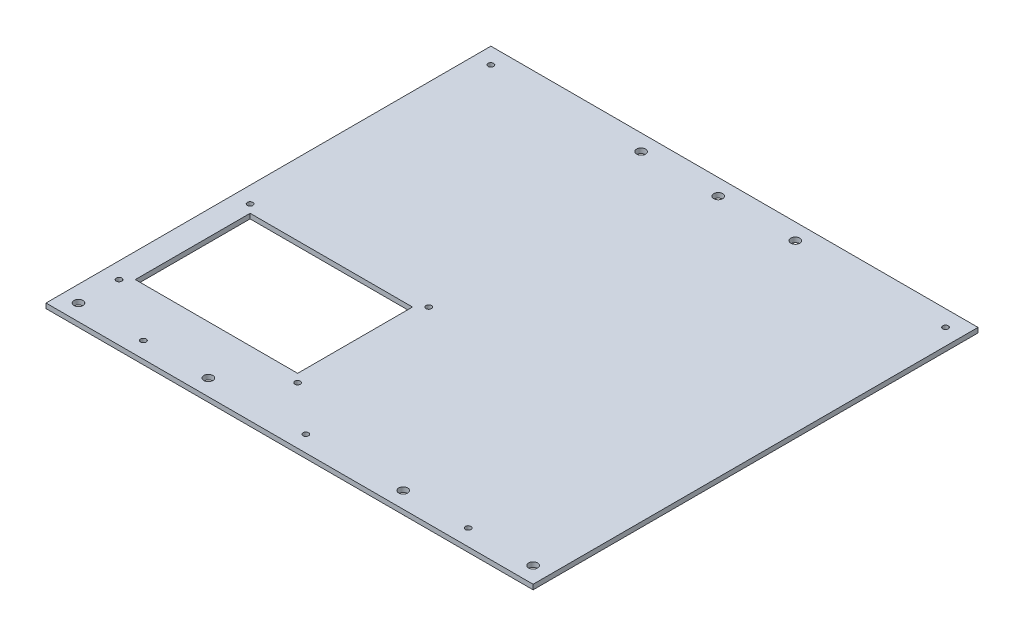
ISO-10303-21;
HEADER;
FILE_DESCRIPTION(('STEP AP214'),'2;1');
FILE_NAME('part.step','',(''),(''),'','','');
FILE_SCHEMA(('AUTOMOTIVE_DESIGN { 1 0 10303 214 1 1 1 1 }'));
ENDSEC;
DATA;
#1=APPLICATION_CONTEXT('core data for automotive mechanical design processes');
#2=APPLICATION_PROTOCOL_DEFINITION('international standard','automotive_design',2000,#1);
#3=PRODUCT_CONTEXT('',#1,'mechanical');
#4=PRODUCT('Part','Part','',(#3));
#5=PRODUCT_RELATED_PRODUCT_CATEGORY('part','',(#4));
#6=PRODUCT_DEFINITION_FORMATION('','',#4);
#7=PRODUCT_DEFINITION_CONTEXT('part definition',#1,'design');
#8=PRODUCT_DEFINITION('design','',#6,#7);
#9=PRODUCT_DEFINITION_SHAPE('','',#8);
#10=(LENGTH_UNIT() NAMED_UNIT(*) SI_UNIT(.MILLI.,.METRE.));
#11=(NAMED_UNIT(*) PLANE_ANGLE_UNIT() SI_UNIT($,.RADIAN.));
#12=(NAMED_UNIT(*) SI_UNIT($,.STERADIAN.) SOLID_ANGLE_UNIT());
#13=UNCERTAINTY_MEASURE_WITH_UNIT(LENGTH_MEASURE(1.E-05),#10,'distance_accuracy_value','');
#14=(GEOMETRIC_REPRESENTATION_CONTEXT(3) GLOBAL_UNCERTAINTY_ASSIGNED_CONTEXT((#13)) GLOBAL_UNIT_ASSIGNED_CONTEXT((#10,
#11,#12)) REPRESENTATION_CONTEXT('',''));
#15=CARTESIAN_POINT('',(0.,0.,0.));
#16=DIRECTION('',(0.,0.,1.));
#17=DIRECTION('',(1.,0.,0.));
#18=AXIS2_PLACEMENT_3D('',#15,#16,#17);
#19=CARTESIAN_POINT('',(0.,3.,0.));
#20=DIRECTION('',(0.,1.,0.));
#21=DIRECTION('',(0.,0.,1.));
#22=AXIS2_PLACEMENT_3D('',#19,#20,#21);
#23=PLANE('',#22);
#24=CARTESIAN_POINT('',(9.99999999999996,3.,-115.707070707071));
#25=DIRECTION('',(0.,1.,0.));
#26=DIRECTION('',(0.,0.,1.));
#27=AXIS2_PLACEMENT_3D('',#24,#25,#26);
#28=CIRCLE('',#27,1.69999999999999);
#29=CARTESIAN_POINT('',(9.99999999999996,3.,-114.007070707071));
#30=VERTEX_POINT('',#29);
#31=EDGE_CURVE('E475',#30,#30,#28,.T.);
#32=ORIENTED_EDGE('',*,*,#31,.F.);
#33=EDGE_LOOP('',(#32));
#34=FACE_BOUND('',#33,.T.);
#35=CARTESIAN_POINT('',(120.,3.,-35.));
#36=DIRECTION('',(0.,1.,0.));
#37=DIRECTION('',(0.,0.,1.));
#38=AXIS2_PLACEMENT_3D('',#35,#36,#37);
#39=CIRCLE('',#38,1.69999999999999);
#40=CARTESIAN_POINT('',(120.,3.,-33.3));
#41=VERTEX_POINT('',#40);
#42=EDGE_CURVE('E477',#41,#41,#39,.T.);
#43=ORIENTED_EDGE('',*,*,#42,.F.);
#44=EDGE_LOOP('',(#43));
#45=FACE_BOUND('',#44,.T.);
#46=CARTESIAN_POINT('',(9.99999999999997,3.,-35.));
#47=DIRECTION('',(0.,1.,0.));
#48=DIRECTION('',(0.,0.,1.));
#49=AXIS2_PLACEMENT_3D('',#46,#47,#48);
#50=CIRCLE('',#49,1.69999999999999);
#51=CARTESIAN_POINT('',(9.99999999999997,3.,-33.3));
#52=VERTEX_POINT('',#51);
#53=EDGE_CURVE('E485',#52,#52,#50,.T.);
#54=ORIENTED_EDGE('',*,*,#53,.F.);
#55=EDGE_LOOP('',(#54));
#56=FACE_BOUND('',#55,.T.);
#57=CARTESIAN_POINT('',(120.,3.,-115.707070707071));
#58=DIRECTION('',(0.,1.,0.));
#59=DIRECTION('',(0.,0.,1.));
#60=AXIS2_PLACEMENT_3D('',#57,#58,#59);
#61=CIRCLE('',#60,1.69999999999999);
#62=CARTESIAN_POINT('',(120.,3.,-114.007070707071));
#63=VERTEX_POINT('',#62);
#64=EDGE_CURVE('E491',#63,#63,#61,.T.);
#65=ORIENTED_EDGE('',*,*,#64,.F.);
#66=EDGE_LOOP('',(#65));
#67=FACE_BOUND('',#66,.T.);
#68=DIRECTION('',(0.,0.,1.));
#69=VECTOR('',#68,1.);
#70=CARTESIAN_POINT('',(15.,3.,-110.707070707071));
#71=LINE('',#70,#69);
#72=CARTESIAN_POINT('',(15.,3.,-110.707070707071));
#73=VERTEX_POINT('',#72);
#74=CARTESIAN_POINT('',(15.,3.,-40.));
#75=VERTEX_POINT('',#74);
#76=EDGE_CURVE('E55',#73,#75,#71,.T.);
#77=ORIENTED_EDGE('',*,*,#76,.F.);
#78=DIRECTION('',(-1.,0.,0.));
#79=VECTOR('',#78,1.);
#80=CARTESIAN_POINT('',(15.,3.,-110.707070707071));
#81=LINE('',#80,#79);
#82=CARTESIAN_POINT('',(115.,3.,-110.707070707071));
#83=VERTEX_POINT('',#82);
#84=EDGE_CURVE('E123',#83,#73,#81,.T.);
#85=ORIENTED_EDGE('',*,*,#84,.F.);
#86=DIRECTION('',(0.,0.,-1.));
#87=VECTOR('',#86,1.);
#88=CARTESIAN_POINT('',(115.,3.,-110.707070707071));
#89=LINE('',#88,#87);
#90=CARTESIAN_POINT('',(115.,3.,-40.));
#91=VERTEX_POINT('',#90);
#92=EDGE_CURVE('E108',#91,#83,#89,.T.);
#93=ORIENTED_EDGE('',*,*,#92,.F.);
#94=DIRECTION('',(1.,0.,0.));
#95=VECTOR('',#94,1.);
#96=CARTESIAN_POINT('',(15.,3.,-40.));
#97=LINE('',#96,#95);
#98=EDGE_CURVE('E117',#75,#91,#97,.T.);
#99=ORIENTED_EDGE('',*,*,#98,.F.);
#100=EDGE_LOOP('',(#77,#85,#93,#99));
#101=FACE_BOUND('',#100,.T.);
#102=CARTESIAN_POINT('',(250.,3.,-10.));
#103=DIRECTION('',(0.,1.,0.));
#104=DIRECTION('',(0.,0.,1.));
#105=AXIS2_PLACEMENT_3D('',#102,#103,#104);
#106=CIRCLE('',#105,1.69999999999998);
#107=CARTESIAN_POINT('',(250.,3.,-8.30000000000002));
#108=VERTEX_POINT('',#107);
#109=EDGE_CURVE('E130',#108,#108,#106,.T.);
#110=ORIENTED_EDGE('',*,*,#109,.F.);
#111=EDGE_LOOP('',(#110));
#112=FACE_BOUND('',#111,.T.);
#113=CARTESIAN_POINT('',(150.,3.,-10.));
#114=DIRECTION('',(0.,1.,0.));
#115=DIRECTION('',(0.,0.,1.));
#116=AXIS2_PLACEMENT_3D('',#113,#114,#115);
#117=CIRCLE('',#116,1.70000000000001);
#118=CARTESIAN_POINT('',(150.,3.,-8.3));
#119=VERTEX_POINT('',#118);
#120=EDGE_CURVE('E138',#119,#119,#117,.T.);
#121=ORIENTED_EDGE('',*,*,#120,.F.);
#122=EDGE_LOOP('',(#121));
#123=FACE_BOUND('',#122,.T.);
#124=CARTESIAN_POINT('',(50.,3.,-10.));
#125=DIRECTION('',(0.,1.,0.));
#126=DIRECTION('',(0.,0.,1.));
#127=AXIS2_PLACEMENT_3D('',#124,#125,#126);
#128=CIRCLE('',#127,1.7);
#129=CARTESIAN_POINT('',(50.,3.,-8.3));
#130=VERTEX_POINT('',#129);
#131=EDGE_CURVE('E144',#130,#130,#128,.T.);
#132=ORIENTED_EDGE('',*,*,#131,.F.);
#133=EDGE_LOOP('',(#132));
#134=FACE_BOUND('',#133,.T.);
#135=CARTESIAN_POINT('',(10.,3.,-264.));
#136=DIRECTION('',(0.,1.,0.));
#137=DIRECTION('',(0.,0.,1.));
#138=AXIS2_PLACEMENT_3D('',#135,#136,#137);
#139=CIRCLE('',#138,1.7);
#140=CARTESIAN_POINT('',(10.,3.,-262.3));
#141=VERTEX_POINT('',#140);
#142=EDGE_CURVE('E150',#141,#141,#139,.T.);
#143=ORIENTED_EDGE('',*,*,#142,.F.);
#144=EDGE_LOOP('',(#143));
#145=FACE_BOUND('',#144,.T.);
#146=CARTESIAN_POINT('',(290.,3.,-264.));
#147=DIRECTION('',(0.,1.,0.));
#148=DIRECTION('',(0.,0.,1.));
#149=AXIS2_PLACEMENT_3D('',#146,#147,#148);
#150=CIRCLE('',#149,1.69999999999998);
#151=CARTESIAN_POINT('',(290.,3.,-262.3));
#152=VERTEX_POINT('',#151);
#153=EDGE_CURVE('E156',#152,#152,#150,.T.);
#154=ORIENTED_EDGE('',*,*,#153,.F.);
#155=EDGE_LOOP('',(#154));
#156=FACE_BOUND('',#155,.T.);
#157=CARTESIAN_POINT('',(10.,3.,-10.));
#158=DIRECTION('',(0.,-1.,0.));
#159=DIRECTION('',(0.,0.,-1.));
#160=AXIS2_PLACEMENT_3D('',#157,#158,#159);
#161=CIRCLE('',#160,2.75);
#162=CARTESIAN_POINT('',(10.,3.,-12.75));
#163=VERTEX_POINT('',#162);
#164=EDGE_CURVE('E165',#163,#163,#161,.T.);
#165=ORIENTED_EDGE('',*,*,#164,.T.);
#166=EDGE_LOOP('',(#165));
#167=FACE_BOUND('',#166,.T.);
#168=DIRECTION('',(1.,0.,0.));
#169=VECTOR('',#168,1.);
#170=CARTESIAN_POINT('',(0.,3.,0.));
#171=LINE('',#170,#169);
#172=CARTESIAN_POINT('',(0.,3.,0.));
#173=VERTEX_POINT('',#172);
#174=CARTESIAN_POINT('',(300.,3.,0.));
#175=VERTEX_POINT('',#174);
#176=EDGE_CURVE('E205',#173,#175,#171,.T.);
#177=ORIENTED_EDGE('',*,*,#176,.T.);
#178=DIRECTION('',(0.,0.,-1.));
#179=VECTOR('',#178,1.);
#180=CARTESIAN_POINT('',(300.,3.,0.));
#181=LINE('',#180,#179);
#182=CARTESIAN_POINT('',(300.,3.,-274.));
#183=VERTEX_POINT('',#182);
#184=EDGE_CURVE('E208',#175,#183,#181,.T.);
#185=ORIENTED_EDGE('',*,*,#184,.T.);
#186=DIRECTION('',(1.,0.,0.));
#187=VECTOR('',#186,1.);
#188=CARTESIAN_POINT('',(0.,3.,-274.));
#189=LINE('',#188,#187);
#190=CARTESIAN_POINT('',(-1.11022302462516E-13,3.,-274.));
#191=VERTEX_POINT('',#190);
#192=EDGE_CURVE('E211',#191,#183,#189,.T.);
#193=ORIENTED_EDGE('',*,*,#192,.F.);
#194=DIRECTION('',(0.,0.,-1.));
#195=VECTOR('',#194,1.);
#196=CARTESIAN_POINT('',(0.,3.,0.));
#197=LINE('',#196,#195);
#198=EDGE_CURVE('E214',#173,#191,#197,.T.);
#199=ORIENTED_EDGE('',*,*,#198,.F.);
#200=EDGE_LOOP('',(#177,#185,#193,#199));
#201=FACE_BOUND('',#200,.T.);
#202=CARTESIAN_POINT('',(150.,3.,-264.));
#203=DIRECTION('',(0.,-1.,0.));
#204=DIRECTION('',(0.,0.,-1.));
#205=AXIS2_PLACEMENT_3D('',#202,#203,#204);
#206=CIRCLE('',#205,2.75);
#207=CARTESIAN_POINT('',(150.,3.,-266.75));
#208=VERTEX_POINT('',#207);
#209=EDGE_CURVE('E201',#208,#208,#206,.T.);
#210=ORIENTED_EDGE('',*,*,#209,.T.);
#211=EDGE_LOOP('',(#210));
#212=FACE_BOUND('',#211,.T.);
#213=CARTESIAN_POINT('',(102.5,3.,-264.));
#214=DIRECTION('',(0.,-1.,0.));
#215=DIRECTION('',(0.,0.,-1.));
#216=AXIS2_PLACEMENT_3D('',#213,#214,#215);
#217=CIRCLE('',#216,2.75);
#218=CARTESIAN_POINT('',(102.5,3.,-266.75));
#219=VERTEX_POINT('',#218);
#220=EDGE_CURVE('E195',#219,#219,#217,.T.);
#221=ORIENTED_EDGE('',*,*,#220,.T.);
#222=EDGE_LOOP('',(#221));
#223=FACE_BOUND('',#222,.T.);
#224=CARTESIAN_POINT('',(197.5,3.,-264.));
#225=DIRECTION('',(0.,-1.,0.));
#226=DIRECTION('',(0.,0.,-1.));
#227=AXIS2_PLACEMENT_3D('',#224,#225,#226);
#228=CIRCLE('',#227,2.75);
#229=CARTESIAN_POINT('',(197.5,3.,-266.75));
#230=VERTEX_POINT('',#229);
#231=EDGE_CURVE('E189',#230,#230,#228,.T.);
#232=ORIENTED_EDGE('',*,*,#231,.T.);
#233=EDGE_LOOP('',(#232));
#234=FACE_BOUND('',#233,.T.);
#235=CARTESIAN_POINT('',(290.,3.,-10.));
#236=DIRECTION('',(0.,-1.,0.));
#237=DIRECTION('',(0.,0.,-1.));
#238=AXIS2_PLACEMENT_3D('',#235,#236,#237);
#239=CIRCLE('',#238,2.74999999999997);
#240=CARTESIAN_POINT('',(290.,3.,-12.75));
#241=VERTEX_POINT('',#240);
#242=EDGE_CURVE('E183',#241,#241,#239,.T.);
#243=ORIENTED_EDGE('',*,*,#242,.T.);
#244=EDGE_LOOP('',(#243));
#245=FACE_BOUND('',#244,.T.);
#246=CARTESIAN_POINT('',(210.,3.,-10.));
#247=DIRECTION('',(0.,-1.,0.));
#248=DIRECTION('',(0.,0.,-1.));
#249=AXIS2_PLACEMENT_3D('',#246,#247,#248);
#250=CIRCLE('',#249,2.75);
#251=CARTESIAN_POINT('',(210.,3.,-12.75));
#252=VERTEX_POINT('',#251);
#253=EDGE_CURVE('E177',#252,#252,#250,.T.);
#254=ORIENTED_EDGE('',*,*,#253,.T.);
#255=EDGE_LOOP('',(#254));
#256=FACE_BOUND('',#255,.T.);
#257=CARTESIAN_POINT('',(90.,3.,-10.));
#258=DIRECTION('',(0.,-1.,0.));
#259=DIRECTION('',(0.,0.,-1.));
#260=AXIS2_PLACEMENT_3D('',#257,#258,#259);
#261=CIRCLE('',#260,2.75);
#262=CARTESIAN_POINT('',(90.,3.,-12.75));
#263=VERTEX_POINT('',#262);
#264=EDGE_CURVE('E171',#263,#263,#261,.T.);
#265=ORIENTED_EDGE('',*,*,#264,.T.);
#266=EDGE_LOOP('',(#265));
#267=FACE_BOUND('',#266,.T.);
#268=ADVANCED_FACE('F40',(#34,#45,#56,#67,#101,#112,#123,#134,#145,#156,#167,#201,#212,#223,
#234,#245,#256,#267),#23,.T.);
#269=CARTESIAN_POINT('',(0.,3.,0.));
#270=DIRECTION('',(0.,0.,-1.));
#271=DIRECTION('',(-1.,0.,0.));
#272=AXIS2_PLACEMENT_3D('',#269,#270,#271);
#273=PLANE('',#272);
#274=DIRECTION('',(1.,0.,0.));
#275=VECTOR('',#274,1.);
#276=CARTESIAN_POINT('',(0.,0.,0.));
#277=LINE('',#276,#275);
#278=CARTESIAN_POINT('',(0.,0.,0.));
#279=VERTEX_POINT('',#278);
#280=CARTESIAN_POINT('',(300.,0.,0.));
#281=VERTEX_POINT('',#280);
#282=EDGE_CURVE('E204',#279,#281,#277,.T.);
#283=ORIENTED_EDGE('',*,*,#282,.T.);
#284=DIRECTION('',(0.,-1.,0.));
#285=VECTOR('',#284,1.);
#286=CARTESIAN_POINT('',(300.,3.,0.));
#287=LINE('',#286,#285);
#288=EDGE_CURVE('E233',#175,#281,#287,.T.);
#289=ORIENTED_EDGE('',*,*,#288,.F.);
#290=ORIENTED_EDGE('',*,*,#176,.F.);
#291=DIRECTION('',(0.,-1.,0.));
#292=VECTOR('',#291,1.);
#293=CARTESIAN_POINT('',(0.,3.,0.));
#294=LINE('',#293,#292);
#295=EDGE_CURVE('E217',#173,#279,#294,.T.);
#296=ORIENTED_EDGE('',*,*,#295,.T.);
#297=EDGE_LOOP('',(#283,#289,#290,#296));
#298=FACE_BOUND('',#297,.T.);
#299=ADVANCED_FACE('F42',(#298),#273,.F.);
#300=CARTESIAN_POINT('',(300.,3.,0.));
#301=DIRECTION('',(-1.,0.,0.));
#302=DIRECTION('',(0.,0.,1.));
#303=AXIS2_PLACEMENT_3D('',#300,#301,#302);
#304=PLANE('',#303);
#305=DIRECTION('',(0.,0.,-1.));
#306=VECTOR('',#305,1.);
#307=CARTESIAN_POINT('',(300.,0.,0.));
#308=LINE('',#307,#306);
#309=CARTESIAN_POINT('',(300.,0.,-274.));
#310=VERTEX_POINT('',#309);
#311=EDGE_CURVE('E220',#281,#310,#308,.T.);
#312=ORIENTED_EDGE('',*,*,#311,.T.);
#313=DIRECTION('',(0.,-1.,0.));
#314=VECTOR('',#313,1.);
#315=CARTESIAN_POINT('',(300.,3.,-274.));
#316=LINE('',#315,#314);
#317=EDGE_CURVE('E231',#183,#310,#316,.T.);
#318=ORIENTED_EDGE('',*,*,#317,.F.);
#319=ORIENTED_EDGE('',*,*,#184,.F.);
#320=ORIENTED_EDGE('',*,*,#288,.T.);
#321=EDGE_LOOP('',(#312,#318,#319,#320));
#322=FACE_BOUND('',#321,.T.);
#323=ADVANCED_FACE('F266',(#322),#304,.F.);
#324=CARTESIAN_POINT('',(0.,3.,-274.));
#325=DIRECTION('',(0.,0.,-1.));
#326=DIRECTION('',(-1.,0.,0.));
#327=AXIS2_PLACEMENT_3D('',#324,#325,#326);
#328=PLANE('',#327);
#329=DIRECTION('',(1.,0.,0.));
#330=VECTOR('',#329,1.);
#331=CARTESIAN_POINT('',(0.,0.,-274.));
#332=LINE('',#331,#330);
#333=CARTESIAN_POINT('',(-1.11022302462516E-13,0.,-274.));
#334=VERTEX_POINT('',#333);
#335=EDGE_CURVE('E223',#334,#310,#332,.T.);
#336=ORIENTED_EDGE('',*,*,#335,.F.);
#337=DIRECTION('',(0.,-1.,0.));
#338=VECTOR('',#337,1.);
#339=CARTESIAN_POINT('',(-1.11022302462516E-13,3.,-274.));
#340=LINE('',#339,#338);
#341=EDGE_CURVE('E229',#191,#334,#340,.T.);
#342=ORIENTED_EDGE('',*,*,#341,.F.);
#343=ORIENTED_EDGE('',*,*,#192,.T.);
#344=ORIENTED_EDGE('',*,*,#317,.T.);
#345=EDGE_LOOP('',(#336,#342,#343,#344));
#346=FACE_BOUND('',#345,.T.);
#347=ADVANCED_FACE('F279',(#346),#328,.T.);
#348=CARTESIAN_POINT('',(0.,3.,0.));
#349=DIRECTION('',(-1.,0.,0.));
#350=DIRECTION('',(0.,0.,1.));
#351=AXIS2_PLACEMENT_3D('',#348,#349,#350);
#352=PLANE('',#351);
#353=DIRECTION('',(0.,0.,-1.));
#354=VECTOR('',#353,1.);
#355=CARTESIAN_POINT('',(0.,0.,0.));
#356=LINE('',#355,#354);
#357=EDGE_CURVE('E209',#279,#334,#356,.T.);
#358=ORIENTED_EDGE('',*,*,#357,.F.);
#359=ORIENTED_EDGE('',*,*,#295,.F.);
#360=ORIENTED_EDGE('',*,*,#198,.T.);
#361=ORIENTED_EDGE('',*,*,#341,.T.);
#362=EDGE_LOOP('',(#358,#359,#360,#361));
#363=FACE_BOUND('',#362,.T.);
#364=ADVANCED_FACE('F275',(#363),#352,.T.);
#365=CARTESIAN_POINT('',(0.,0.,0.));
#366=DIRECTION('',(0.,1.,0.));
#367=DIRECTION('',(0.,0.,1.));
#368=AXIS2_PLACEMENT_3D('',#365,#366,#367);
#369=PLANE('',#368);
#370=CARTESIAN_POINT('',(9.99999999999996,0.,-115.707070707071));
#371=DIRECTION('',(0.,1.,0.));
#372=DIRECTION('',(0.,0.,1.));
#373=AXIS2_PLACEMENT_3D('',#370,#371,#372);
#374=CIRCLE('',#373,1.7);
#375=CARTESIAN_POINT('',(9.99999999999996,0.,-114.007070707071));
#376=VERTEX_POINT('',#375);
#377=EDGE_CURVE('E473',#376,#376,#374,.T.);
#378=ORIENTED_EDGE('',*,*,#377,.T.);
#379=EDGE_LOOP('',(#378));
#380=FACE_BOUND('',#379,.T.);
#381=CARTESIAN_POINT('',(120.,0.,-35.));
#382=DIRECTION('',(0.,1.,0.));
#383=DIRECTION('',(0.,0.,1.));
#384=AXIS2_PLACEMENT_3D('',#381,#382,#383);
#385=CIRCLE('',#384,1.69999999999999);
#386=CARTESIAN_POINT('',(120.,0.,-33.3));
#387=VERTEX_POINT('',#386);
#388=EDGE_CURVE('E482',#387,#387,#385,.T.);
#389=ORIENTED_EDGE('',*,*,#388,.T.);
#390=EDGE_LOOP('',(#389));
#391=FACE_BOUND('',#390,.T.);
#392=CARTESIAN_POINT('',(9.99999999999997,0.,-35.));
#393=DIRECTION('',(0.,1.,0.));
#394=DIRECTION('',(0.,0.,1.));
#395=AXIS2_PLACEMENT_3D('',#392,#393,#394);
#396=CIRCLE('',#395,1.7);
#397=CARTESIAN_POINT('',(9.99999999999997,0.,-33.3));
#398=VERTEX_POINT('',#397);
#399=EDGE_CURVE('E488',#398,#398,#396,.T.);
#400=ORIENTED_EDGE('',*,*,#399,.T.);
#401=EDGE_LOOP('',(#400));
#402=FACE_BOUND('',#401,.T.);
#403=CARTESIAN_POINT('',(120.,0.,-115.707070707071));
#404=DIRECTION('',(0.,1.,0.));
#405=DIRECTION('',(0.,0.,1.));
#406=AXIS2_PLACEMENT_3D('',#403,#404,#405);
#407=CIRCLE('',#406,1.69999999999999);
#408=CARTESIAN_POINT('',(120.,0.,-114.007070707071));
#409=VERTEX_POINT('',#408);
#410=EDGE_CURVE('E494',#409,#409,#407,.T.);
#411=ORIENTED_EDGE('',*,*,#410,.T.);
#412=EDGE_LOOP('',(#411));
#413=FACE_BOUND('',#412,.T.);
#414=DIRECTION('',(-1.,0.,0.));
#415=VECTOR('',#414,1.);
#416=CARTESIAN_POINT('',(0.,0.,-110.707070707071));
#417=LINE('',#416,#415);
#418=CARTESIAN_POINT('',(115.,0.,-110.707070707071));
#419=VERTEX_POINT('',#418);
#420=CARTESIAN_POINT('',(15.,0.,-110.707070707071));
#421=VERTEX_POINT('',#420);
#422=EDGE_CURVE('E48',#419,#421,#417,.T.);
#423=ORIENTED_EDGE('',*,*,#422,.T.);
#424=DIRECTION('',(0.,0.,1.));
#425=VECTOR('',#424,1.);
#426=CARTESIAN_POINT('',(15.,0.,0.));
#427=LINE('',#426,#425);
#428=CARTESIAN_POINT('',(15.,0.,-40.));
#429=VERTEX_POINT('',#428);
#430=EDGE_CURVE('E11',#421,#429,#427,.T.);
#431=ORIENTED_EDGE('',*,*,#430,.T.);
#432=DIRECTION('',(1.,0.,0.));
#433=VECTOR('',#432,1.);
#434=CARTESIAN_POINT('',(0.,0.,-40.));
#435=LINE('',#434,#433);
#436=CARTESIAN_POINT('',(115.,0.,-40.));
#437=VERTEX_POINT('',#436);
#438=EDGE_CURVE('E236',#429,#437,#435,.T.);
#439=ORIENTED_EDGE('',*,*,#438,.T.);
#440=DIRECTION('',(0.,0.,-1.));
#441=VECTOR('',#440,1.);
#442=CARTESIAN_POINT('',(115.,0.,0.));
#443=LINE('',#442,#441);
#444=EDGE_CURVE('E111',#437,#419,#443,.T.);
#445=ORIENTED_EDGE('',*,*,#444,.T.);
#446=EDGE_LOOP('',(#423,#431,#439,#445));
#447=FACE_BOUND('',#446,.T.);
#448=CARTESIAN_POINT('',(250.,0.,-10.));
#449=DIRECTION('',(0.,1.,0.));
#450=DIRECTION('',(0.,0.,1.));
#451=AXIS2_PLACEMENT_3D('',#448,#449,#450);
#452=CIRCLE('',#451,1.69999999999998);
#453=CARTESIAN_POINT('',(250.,0.,-8.30000000000002));
#454=VERTEX_POINT('',#453);
#455=EDGE_CURVE('E135',#454,#454,#452,.T.);
#456=ORIENTED_EDGE('',*,*,#455,.T.);
#457=EDGE_LOOP('',(#456));
#458=FACE_BOUND('',#457,.T.);
#459=CARTESIAN_POINT('',(150.,0.,-10.));
#460=DIRECTION('',(0.,1.,0.));
#461=DIRECTION('',(0.,0.,1.));
#462=AXIS2_PLACEMENT_3D('',#459,#460,#461);
#463=CIRCLE('',#462,1.70000000000001);
#464=CARTESIAN_POINT('',(150.,0.,-8.3));
#465=VERTEX_POINT('',#464);
#466=EDGE_CURVE('E141',#465,#465,#463,.T.);
#467=ORIENTED_EDGE('',*,*,#466,.T.);
#468=EDGE_LOOP('',(#467));
#469=FACE_BOUND('',#468,.T.);
#470=CARTESIAN_POINT('',(50.,0.,-10.));
#471=DIRECTION('',(0.,1.,0.));
#472=DIRECTION('',(0.,0.,1.));
#473=AXIS2_PLACEMENT_3D('',#470,#471,#472);
#474=CIRCLE('',#473,1.7);
#475=CARTESIAN_POINT('',(50.,0.,-8.3));
#476=VERTEX_POINT('',#475);
#477=EDGE_CURVE('E147',#476,#476,#474,.T.);
#478=ORIENTED_EDGE('',*,*,#477,.T.);
#479=EDGE_LOOP('',(#478));
#480=FACE_BOUND('',#479,.T.);
#481=CARTESIAN_POINT('',(10.,0.,-264.));
#482=DIRECTION('',(0.,1.,0.));
#483=DIRECTION('',(0.,0.,1.));
#484=AXIS2_PLACEMENT_3D('',#481,#482,#483);
#485=CIRCLE('',#484,1.7);
#486=CARTESIAN_POINT('',(10.,0.,-262.3));
#487=VERTEX_POINT('',#486);
#488=EDGE_CURVE('E153',#487,#487,#485,.T.);
#489=ORIENTED_EDGE('',*,*,#488,.T.);
#490=EDGE_LOOP('',(#489));
#491=FACE_BOUND('',#490,.T.);
#492=CARTESIAN_POINT('',(290.,0.,-264.));
#493=DIRECTION('',(0.,1.,0.));
#494=DIRECTION('',(0.,0.,1.));
#495=AXIS2_PLACEMENT_3D('',#492,#493,#494);
#496=CIRCLE('',#495,1.69999999999998);
#497=CARTESIAN_POINT('',(290.,0.,-262.3));
#498=VERTEX_POINT('',#497);
#499=EDGE_CURVE('E159',#498,#498,#496,.T.);
#500=ORIENTED_EDGE('',*,*,#499,.T.);
#501=EDGE_LOOP('',(#500));
#502=FACE_BOUND('',#501,.T.);
#503=CARTESIAN_POINT('',(10.,0.,-10.));
#504=DIRECTION('',(0.,-1.,0.));
#505=DIRECTION('',(0.,0.,-1.));
#506=AXIS2_PLACEMENT_3D('',#503,#504,#505);
#507=CIRCLE('',#506,2.74999999999999);
#508=CARTESIAN_POINT('',(10.,0.,-12.75));
#509=VERTEX_POINT('',#508);
#510=EDGE_CURVE('E162',#509,#509,#507,.T.);
#511=ORIENTED_EDGE('',*,*,#510,.F.);
#512=EDGE_LOOP('',(#511));
#513=FACE_BOUND('',#512,.T.);
#514=CARTESIAN_POINT('',(90.,0.,-10.));
#515=DIRECTION('',(0.,-1.,0.));
#516=DIRECTION('',(0.,0.,-1.));
#517=AXIS2_PLACEMENT_3D('',#514,#515,#516);
#518=CIRCLE('',#517,2.74999999999999);
#519=CARTESIAN_POINT('',(90.,0.,-12.75));
#520=VERTEX_POINT('',#519);
#521=EDGE_CURVE('E168',#520,#520,#518,.T.);
#522=ORIENTED_EDGE('',*,*,#521,.F.);
#523=EDGE_LOOP('',(#522));
#524=FACE_BOUND('',#523,.T.);
#525=CARTESIAN_POINT('',(210.,0.,-10.));
#526=DIRECTION('',(0.,-1.,0.));
#527=DIRECTION('',(0.,0.,-1.));
#528=AXIS2_PLACEMENT_3D('',#525,#526,#527);
#529=CIRCLE('',#528,2.74999999999997);
#530=CARTESIAN_POINT('',(210.,0.,-12.75));
#531=VERTEX_POINT('',#530);
#532=EDGE_CURVE('E174',#531,#531,#529,.T.);
#533=ORIENTED_EDGE('',*,*,#532,.F.);
#534=EDGE_LOOP('',(#533));
#535=FACE_BOUND('',#534,.T.);
#536=CARTESIAN_POINT('',(290.,0.,-10.));
#537=DIRECTION('',(0.,-1.,0.));
#538=DIRECTION('',(0.,0.,-1.));
#539=AXIS2_PLACEMENT_3D('',#536,#537,#538);
#540=CIRCLE('',#539,2.74999999999997);
#541=CARTESIAN_POINT('',(290.,0.,-12.75));
#542=VERTEX_POINT('',#541);
#543=EDGE_CURVE('E180',#542,#542,#540,.T.);
#544=ORIENTED_EDGE('',*,*,#543,.F.);
#545=EDGE_LOOP('',(#544));
#546=FACE_BOUND('',#545,.T.);
#547=CARTESIAN_POINT('',(197.5,0.,-264.));
#548=DIRECTION('',(0.,-1.,0.));
#549=DIRECTION('',(0.,0.,-1.));
#550=AXIS2_PLACEMENT_3D('',#547,#548,#549);
#551=CIRCLE('',#550,2.74999999999997);
#552=CARTESIAN_POINT('',(197.5,0.,-266.75));
#553=VERTEX_POINT('',#552);
#554=EDGE_CURVE('E186',#553,#553,#551,.T.);
#555=ORIENTED_EDGE('',*,*,#554,.F.);
#556=EDGE_LOOP('',(#555));
#557=FACE_BOUND('',#556,.T.);
#558=CARTESIAN_POINT('',(102.5,0.,-264.));
#559=DIRECTION('',(0.,-1.,0.));
#560=DIRECTION('',(0.,0.,-1.));
#561=AXIS2_PLACEMENT_3D('',#558,#559,#560);
#562=CIRCLE('',#561,2.74999999999999);
#563=CARTESIAN_POINT('',(102.5,0.,-266.75));
#564=VERTEX_POINT('',#563);
#565=EDGE_CURVE('E192',#564,#564,#562,.T.);
#566=ORIENTED_EDGE('',*,*,#565,.F.);
#567=EDGE_LOOP('',(#566));
#568=FACE_BOUND('',#567,.T.);
#569=CARTESIAN_POINT('',(150.,0.,-264.));
#570=DIRECTION('',(0.,-1.,0.));
#571=DIRECTION('',(0.,0.,-1.));
#572=AXIS2_PLACEMENT_3D('',#569,#570,#571);
#573=CIRCLE('',#572,2.75);
#574=CARTESIAN_POINT('',(150.,0.,-266.75));
#575=VERTEX_POINT('',#574);
#576=EDGE_CURVE('E198',#575,#575,#573,.T.);
#577=ORIENTED_EDGE('',*,*,#576,.F.);
#578=EDGE_LOOP('',(#577));
#579=FACE_BOUND('',#578,.T.);
#580=ORIENTED_EDGE('',*,*,#282,.F.);
#581=ORIENTED_EDGE('',*,*,#357,.T.);
#582=ORIENTED_EDGE('',*,*,#335,.T.);
#583=ORIENTED_EDGE('',*,*,#311,.F.);
#584=EDGE_LOOP('',(#580,#581,#582,#583));
#585=FACE_BOUND('',#584,.T.);
#586=ADVANCED_FACE('F240',(#380,#391,#402,#413,#447,#458,#469,#480,#491,#502,#513,#524,#535,
#546,#557,#568,#579,#585),#369,.F.);
#587=CARTESIAN_POINT('',(150.,0.,-264.));
#588=DIRECTION('',(0.,-1.,0.));
#589=DIRECTION('',(0.,0.,-1.));
#590=AXIS2_PLACEMENT_3D('',#587,#588,#589);
#591=CYLINDRICAL_SURFACE('',#590,2.75);
#592=ORIENTED_EDGE('',*,*,#209,.F.);
#593=EDGE_LOOP('',(#592));
#594=FACE_BOUND('',#593,.T.);
#595=ORIENTED_EDGE('',*,*,#576,.T.);
#596=EDGE_LOOP('',(#595));
#597=FACE_BOUND('',#596,.T.);
#598=ADVANCED_FACE('F272',(#594,#597),#591,.F.);
#599=CARTESIAN_POINT('',(102.5,0.,-264.));
#600=DIRECTION('',(0.,-1.,0.));
#601=DIRECTION('',(0.,0.,-1.));
#602=AXIS2_PLACEMENT_3D('',#599,#600,#601);
#603=CYLINDRICAL_SURFACE('',#602,2.75);
#604=ORIENTED_EDGE('',*,*,#220,.F.);
#605=EDGE_LOOP('',(#604));
#606=FACE_BOUND('',#605,.T.);
#607=ORIENTED_EDGE('',*,*,#565,.T.);
#608=EDGE_LOOP('',(#607));
#609=FACE_BOUND('',#608,.T.);
#610=ADVANCED_FACE('F330',(#606,#609),#603,.F.);
#611=CARTESIAN_POINT('',(197.5,0.,-264.));
#612=DIRECTION('',(0.,-1.,0.));
#613=DIRECTION('',(0.,0.,-1.));
#614=AXIS2_PLACEMENT_3D('',#611,#612,#613);
#615=CYLINDRICAL_SURFACE('',#614,2.74999999999999);
#616=ORIENTED_EDGE('',*,*,#231,.F.);
#617=EDGE_LOOP('',(#616));
#618=FACE_BOUND('',#617,.T.);
#619=ORIENTED_EDGE('',*,*,#554,.T.);
#620=EDGE_LOOP('',(#619));
#621=FACE_BOUND('',#620,.T.);
#622=ADVANCED_FACE('F335',(#618,#621),#615,.F.);
#623=CARTESIAN_POINT('',(290.,0.,-10.));
#624=DIRECTION('',(0.,-1.,0.));
#625=DIRECTION('',(0.,0.,-1.));
#626=AXIS2_PLACEMENT_3D('',#623,#624,#625);
#627=CYLINDRICAL_SURFACE('',#626,2.74999999999997);
#628=ORIENTED_EDGE('',*,*,#242,.F.);
#629=EDGE_LOOP('',(#628));
#630=FACE_BOUND('',#629,.T.);
#631=ORIENTED_EDGE('',*,*,#543,.T.);
#632=EDGE_LOOP('',(#631));
#633=FACE_BOUND('',#632,.T.);
#634=ADVANCED_FACE('F340',(#630,#633),#627,.F.);
#635=CARTESIAN_POINT('',(210.,0.,-10.));
#636=DIRECTION('',(0.,-1.,0.));
#637=DIRECTION('',(0.,0.,-1.));
#638=AXIS2_PLACEMENT_3D('',#635,#636,#637);
#639=CYLINDRICAL_SURFACE('',#638,2.74999999999999);
#640=ORIENTED_EDGE('',*,*,#253,.F.);
#641=EDGE_LOOP('',(#640));
#642=FACE_BOUND('',#641,.T.);
#643=ORIENTED_EDGE('',*,*,#532,.T.);
#644=EDGE_LOOP('',(#643));
#645=FACE_BOUND('',#644,.T.);
#646=ADVANCED_FACE('F314',(#642,#645),#639,.F.);
#647=CARTESIAN_POINT('',(90.,0.,-10.));
#648=DIRECTION('',(0.,-1.,0.));
#649=DIRECTION('',(0.,0.,-1.));
#650=AXIS2_PLACEMENT_3D('',#647,#648,#649);
#651=CYLINDRICAL_SURFACE('',#650,2.75);
#652=ORIENTED_EDGE('',*,*,#264,.F.);
#653=EDGE_LOOP('',(#652));
#654=FACE_BOUND('',#653,.T.);
#655=ORIENTED_EDGE('',*,*,#521,.T.);
#656=EDGE_LOOP('',(#655));
#657=FACE_BOUND('',#656,.T.);
#658=ADVANCED_FACE('F310',(#654,#657),#651,.F.);
#659=CARTESIAN_POINT('',(10.,0.,-10.));
#660=DIRECTION('',(0.,-1.,0.));
#661=DIRECTION('',(0.,0.,-1.));
#662=AXIS2_PLACEMENT_3D('',#659,#660,#661);
#663=CYLINDRICAL_SURFACE('',#662,2.74999999999999);
#664=ORIENTED_EDGE('',*,*,#164,.F.);
#665=EDGE_LOOP('',(#664));
#666=FACE_BOUND('',#665,.T.);
#667=ORIENTED_EDGE('',*,*,#510,.T.);
#668=EDGE_LOOP('',(#667));
#669=FACE_BOUND('',#668,.T.);
#670=ADVANCED_FACE('F313',(#666,#669),#663,.F.);
#671=CARTESIAN_POINT('',(290.,3.,-264.));
#672=DIRECTION('',(0.,1.,0.));
#673=DIRECTION('',(0.,0.,1.));
#674=AXIS2_PLACEMENT_3D('',#671,#672,#673);
#675=CYLINDRICAL_SURFACE('',#674,1.69999999999998);
#676=ORIENTED_EDGE('',*,*,#499,.F.);
#677=EDGE_LOOP('',(#676));
#678=FACE_BOUND('',#677,.T.);
#679=ORIENTED_EDGE('',*,*,#153,.T.);
#680=EDGE_LOOP('',(#679));
#681=FACE_BOUND('',#680,.T.);
#682=ADVANCED_FACE('F353',(#678,#681),#675,.F.);
#683=CARTESIAN_POINT('',(10.,3.,-264.));
#684=DIRECTION('',(0.,1.,0.));
#685=DIRECTION('',(0.,0.,1.));
#686=AXIS2_PLACEMENT_3D('',#683,#684,#685);
#687=CYLINDRICAL_SURFACE('',#686,1.7);
#688=ORIENTED_EDGE('',*,*,#488,.F.);
#689=EDGE_LOOP('',(#688));
#690=FACE_BOUND('',#689,.T.);
#691=ORIENTED_EDGE('',*,*,#142,.T.);
#692=EDGE_LOOP('',(#691));
#693=FACE_BOUND('',#692,.T.);
#694=ADVANCED_FACE('F357',(#690,#693),#687,.F.);
#695=CARTESIAN_POINT('',(50.,3.,-10.));
#696=DIRECTION('',(0.,1.,0.));
#697=DIRECTION('',(0.,0.,1.));
#698=AXIS2_PLACEMENT_3D('',#695,#696,#697);
#699=CYLINDRICAL_SURFACE('',#698,1.7);
#700=ORIENTED_EDGE('',*,*,#477,.F.);
#701=EDGE_LOOP('',(#700));
#702=FACE_BOUND('',#701,.T.);
#703=ORIENTED_EDGE('',*,*,#131,.T.);
#704=EDGE_LOOP('',(#703));
#705=FACE_BOUND('',#704,.T.);
#706=ADVANCED_FACE('F361',(#702,#705),#699,.F.);
#707=CARTESIAN_POINT('',(150.,3.,-10.));
#708=DIRECTION('',(0.,1.,0.));
#709=DIRECTION('',(0.,0.,1.));
#710=AXIS2_PLACEMENT_3D('',#707,#708,#709);
#711=CYLINDRICAL_SURFACE('',#710,1.70000000000001);
#712=ORIENTED_EDGE('',*,*,#466,.F.);
#713=EDGE_LOOP('',(#712));
#714=FACE_BOUND('',#713,.T.);
#715=ORIENTED_EDGE('',*,*,#120,.T.);
#716=EDGE_LOOP('',(#715));
#717=FACE_BOUND('',#716,.T.);
#718=ADVANCED_FACE('F254',(#714,#717),#711,.F.);
#719=CARTESIAN_POINT('',(250.,3.,-10.));
#720=DIRECTION('',(0.,1.,0.));
#721=DIRECTION('',(0.,0.,1.));
#722=AXIS2_PLACEMENT_3D('',#719,#720,#721);
#723=CYLINDRICAL_SURFACE('',#722,1.69999999999998);
#724=ORIENTED_EDGE('',*,*,#455,.F.);
#725=EDGE_LOOP('',(#724));
#726=FACE_BOUND('',#725,.T.);
#727=ORIENTED_EDGE('',*,*,#109,.T.);
#728=EDGE_LOOP('',(#727));
#729=FACE_BOUND('',#728,.T.);
#730=ADVANCED_FACE('F247',(#726,#729),#723,.F.);
#731=CARTESIAN_POINT('',(15.,-7.,-110.707070707071));
#732=DIRECTION('',(-1.,0.,0.));
#733=DIRECTION('',(0.,0.,1.));
#734=AXIS2_PLACEMENT_3D('',#731,#732,#733);
#735=PLANE('',#734);
#736=DIRECTION('',(0.,1.,0.));
#737=VECTOR('',#736,1.);
#738=CARTESIAN_POINT('',(15.,-7.,-110.707070707071));
#739=LINE('',#738,#737);
#740=EDGE_CURVE('E128',#421,#73,#739,.T.);
#741=ORIENTED_EDGE('',*,*,#740,.T.);
#742=ORIENTED_EDGE('',*,*,#76,.T.);
#743=DIRECTION('',(0.,1.,0.));
#744=VECTOR('',#743,1.);
#745=CARTESIAN_POINT('',(15.,-7.,-40.));
#746=LINE('',#745,#744);
#747=EDGE_CURVE('E114',#429,#75,#746,.T.);
#748=ORIENTED_EDGE('',*,*,#747,.F.);
#749=ORIENTED_EDGE('',*,*,#430,.F.);
#750=EDGE_LOOP('',(#741,#742,#748,#749));
#751=FACE_BOUND('',#750,.T.);
#752=ADVANCED_FACE('F245',(#751),#735,.F.);
#753=CARTESIAN_POINT('',(15.,-7.,-110.707070707071));
#754=DIRECTION('',(0.,0.,-1.));
#755=DIRECTION('',(-1.,0.,0.));
#756=AXIS2_PLACEMENT_3D('',#753,#754,#755);
#757=PLANE('',#756);
#758=DIRECTION('',(0.,1.,0.));
#759=VECTOR('',#758,1.);
#760=CARTESIAN_POINT('',(115.,-7.,-110.707070707071));
#761=LINE('',#760,#759);
#762=EDGE_CURVE('E113',#419,#83,#761,.T.);
#763=ORIENTED_EDGE('',*,*,#762,.T.);
#764=ORIENTED_EDGE('',*,*,#84,.T.);
#765=ORIENTED_EDGE('',*,*,#740,.F.);
#766=ORIENTED_EDGE('',*,*,#422,.F.);
#767=EDGE_LOOP('',(#763,#764,#765,#766));
#768=FACE_BOUND('',#767,.T.);
#769=ADVANCED_FACE('F244',(#768),#757,.F.);
#770=CARTESIAN_POINT('',(115.,-7.,-110.707070707071));
#771=DIRECTION('',(1.,0.,0.));
#772=DIRECTION('',(0.,0.,-1.));
#773=AXIS2_PLACEMENT_3D('',#770,#771,#772);
#774=PLANE('',#773);
#775=DIRECTION('',(0.,1.,0.));
#776=VECTOR('',#775,1.);
#777=CARTESIAN_POINT('',(115.,-7.,-40.));
#778=LINE('',#777,#776);
#779=EDGE_CURVE('E63',#437,#91,#778,.T.);
#780=ORIENTED_EDGE('',*,*,#779,.T.);
#781=ORIENTED_EDGE('',*,*,#92,.T.);
#782=ORIENTED_EDGE('',*,*,#762,.F.);
#783=ORIENTED_EDGE('',*,*,#444,.F.);
#784=EDGE_LOOP('',(#780,#781,#782,#783));
#785=FACE_BOUND('',#784,.T.);
#786=ADVANCED_FACE('F105',(#785),#774,.F.);
#787=CARTESIAN_POINT('',(15.,-7.,-40.));
#788=DIRECTION('',(0.,0.,1.));
#789=DIRECTION('',(1.,0.,0.));
#790=AXIS2_PLACEMENT_3D('',#787,#788,#789);
#791=PLANE('',#790);
#792=ORIENTED_EDGE('',*,*,#747,.T.);
#793=ORIENTED_EDGE('',*,*,#98,.T.);
#794=ORIENTED_EDGE('',*,*,#779,.F.);
#795=ORIENTED_EDGE('',*,*,#438,.F.);
#796=EDGE_LOOP('',(#792,#793,#794,#795));
#797=FACE_BOUND('',#796,.T.);
#798=ADVANCED_FACE('F118',(#797),#791,.F.);
#799=CARTESIAN_POINT('',(120.,3.,-115.707070707071));
#800=DIRECTION('',(0.,1.,0.));
#801=DIRECTION('',(0.,0.,1.));
#802=AXIS2_PLACEMENT_3D('',#799,#800,#801);
#803=CYLINDRICAL_SURFACE('',#802,1.69999999999999);
#804=ORIENTED_EDGE('',*,*,#410,.F.);
#805=EDGE_LOOP('',(#804));
#806=FACE_BOUND('',#805,.T.);
#807=ORIENTED_EDGE('',*,*,#64,.T.);
#808=EDGE_LOOP('',(#807));
#809=FACE_BOUND('',#808,.T.);
#810=ADVANCED_FACE('F429',(#806,#809),#803,.F.);
#811=CARTESIAN_POINT('',(9.99999999999997,3.,-35.));
#812=DIRECTION('',(0.,1.,0.));
#813=DIRECTION('',(0.,0.,1.));
#814=AXIS2_PLACEMENT_3D('',#811,#812,#813);
#815=CYLINDRICAL_SURFACE('',#814,1.69999999999999);
#816=ORIENTED_EDGE('',*,*,#399,.F.);
#817=EDGE_LOOP('',(#816));
#818=FACE_BOUND('',#817,.T.);
#819=ORIENTED_EDGE('',*,*,#53,.T.);
#820=EDGE_LOOP('',(#819));
#821=FACE_BOUND('',#820,.T.);
#822=ADVANCED_FACE('F437',(#818,#821),#815,.F.);
#823=CARTESIAN_POINT('',(120.,3.,-35.));
#824=DIRECTION('',(0.,1.,0.));
#825=DIRECTION('',(0.,0.,1.));
#826=AXIS2_PLACEMENT_3D('',#823,#824,#825);
#827=CYLINDRICAL_SURFACE('',#826,1.69999999999999);
#828=ORIENTED_EDGE('',*,*,#388,.F.);
#829=EDGE_LOOP('',(#828));
#830=FACE_BOUND('',#829,.T.);
#831=ORIENTED_EDGE('',*,*,#42,.T.);
#832=EDGE_LOOP('',(#831));
#833=FACE_BOUND('',#832,.T.);
#834=ADVANCED_FACE('F447',(#830,#833),#827,.F.);
#835=CARTESIAN_POINT('',(9.99999999999996,3.,-115.707070707071));
#836=DIRECTION('',(0.,1.,0.));
#837=DIRECTION('',(0.,0.,1.));
#838=AXIS2_PLACEMENT_3D('',#835,#836,#837);
#839=CYLINDRICAL_SURFACE('',#838,1.69999999999999);
#840=ORIENTED_EDGE('',*,*,#377,.F.);
#841=EDGE_LOOP('',(#840));
#842=FACE_BOUND('',#841,.T.);
#843=ORIENTED_EDGE('',*,*,#31,.T.);
#844=EDGE_LOOP('',(#843));
#845=FACE_BOUND('',#844,.T.);
#846=ADVANCED_FACE('F457',(#842,#845),#839,.F.);
#847=CLOSED_SHELL('',(#268,#299,#323,#347,#364,#586,#598,#610,#622,#634,#646,#658,#670,#682,
#694,#706,#718,#730,#752,#769,#786,#798,#810,#822,#834,#846));
#848=MANIFOLD_SOLID_BREP('B2',#847);
#849=ADVANCED_BREP_SHAPE_REPRESENTATION('',(#18,#848),#14);
#850=SHAPE_DEFINITION_REPRESENTATION(#9,#849);
ENDSEC;
END-ISO-10303-21;
